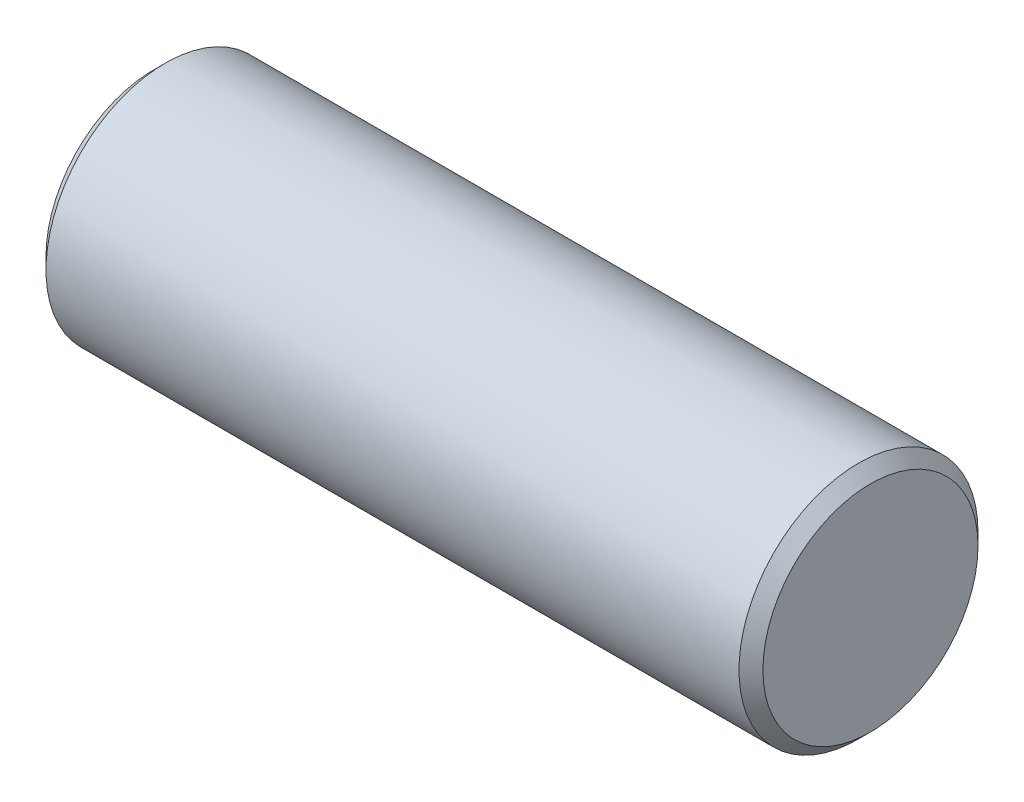
ISO-10303-21;
HEADER;
FILE_DESCRIPTION(('STEP AP214'),'2;1');
FILE_NAME('part.step','',(''),(''),'','','');
FILE_SCHEMA(('AUTOMOTIVE_DESIGN { 1 0 10303 214 1 1 1 1 }'));
ENDSEC;
DATA;
#1=APPLICATION_CONTEXT('core data for automotive mechanical design processes');
#2=APPLICATION_PROTOCOL_DEFINITION('international standard','automotive_design',2000,#1);
#3=PRODUCT_CONTEXT('',#1,'mechanical');
#4=PRODUCT('Part','Part','',(#3));
#5=PRODUCT_RELATED_PRODUCT_CATEGORY('part','',(#4));
#6=PRODUCT_DEFINITION_FORMATION('','',#4);
#7=PRODUCT_DEFINITION_CONTEXT('part definition',#1,'design');
#8=PRODUCT_DEFINITION('design','',#6,#7);
#9=PRODUCT_DEFINITION_SHAPE('','',#8);
#10=(LENGTH_UNIT() NAMED_UNIT(*) SI_UNIT(.MILLI.,.METRE.));
#11=(NAMED_UNIT(*) PLANE_ANGLE_UNIT() SI_UNIT($,.RADIAN.));
#12=(NAMED_UNIT(*) SI_UNIT($,.STERADIAN.) SOLID_ANGLE_UNIT());
#13=UNCERTAINTY_MEASURE_WITH_UNIT(LENGTH_MEASURE(1.E-05),#10,'distance_accuracy_value','');
#14=(GEOMETRIC_REPRESENTATION_CONTEXT(3) GLOBAL_UNCERTAINTY_ASSIGNED_CONTEXT((#13)) GLOBAL_UNIT_ASSIGNED_CONTEXT((#10,
#11,#12)) REPRESENTATION_CONTEXT('',''));
#15=CARTESIAN_POINT('',(0.,0.,0.));
#16=DIRECTION('',(0.,0.,1.));
#17=DIRECTION('',(1.,0.,0.));
#18=AXIS2_PLACEMENT_3D('',#15,#16,#17);
#19=CARTESIAN_POINT('',(0.,0.5,0.));
#20=DIRECTION('',(-1.,0.,0.));
#21=DIRECTION('',(0.,0.,1.));
#22=AXIS2_PLACEMENT_3D('',#19,#20,#21);
#23=PLANE('',#22);
#24=CARTESIAN_POINT('',(0.,0.,0.));
#25=DIRECTION('',(1.,0.,0.));
#26=DIRECTION('',(0.,0.,-1.));
#27=AXIS2_PLACEMENT_3D('',#24,#25,#26);
#28=CIRCLE('',#27,0.9);
#29=CARTESIAN_POINT('',(0.,0.,-0.9));
#30=VERTEX_POINT('',#29);
#31=EDGE_CURVE('E10',#30,#30,#28,.T.);
#32=ORIENTED_EDGE('',*,*,#31,.F.);
#33=EDGE_LOOP('',(#32));
#34=FACE_BOUND('',#33,.T.);
#35=ADVANCED_FACE('F33',(#34),#23,.T.);
#36=CARTESIAN_POINT('',(0.1,0.,0.));
#37=DIRECTION('',(1.,0.,0.));
#38=DIRECTION('',(0.,0.,-1.));
#39=AXIS2_PLACEMENT_3D('',#36,#37,#38);
#40=CONICAL_SURFACE('',#39,1.,0.785398163397447);
#41=ORIENTED_EDGE('',*,*,#31,.T.);
#42=EDGE_LOOP('',(#41));
#43=FACE_BOUND('',#42,.T.);
#44=CARTESIAN_POINT('',(0.1,0.,0.));
#45=DIRECTION('',(1.,0.,0.));
#46=DIRECTION('',(0.,0.,-1.));
#47=AXIS2_PLACEMENT_3D('',#44,#45,#46);
#48=CIRCLE('',#47,1.);
#49=CARTESIAN_POINT('',(0.1,0.,-1.));
#50=VERTEX_POINT('',#49);
#51=EDGE_CURVE('E39',#50,#50,#48,.T.);
#52=ORIENTED_EDGE('',*,*,#51,.F.);
#53=EDGE_LOOP('',(#52));
#54=FACE_BOUND('',#53,.T.);
#55=ADVANCED_FACE('F65',(#43,#54),#40,.T.);
#56=CARTESIAN_POINT('',(6.,0.,0.));
#57=DIRECTION('',(1.,0.,0.));
#58=DIRECTION('',(0.,0.,-1.));
#59=AXIS2_PLACEMENT_3D('',#56,#57,#58);
#60=CYLINDRICAL_SURFACE('',#59,1.);
#61=ORIENTED_EDGE('',*,*,#51,.T.);
#62=EDGE_LOOP('',(#61));
#63=FACE_BOUND('',#62,.T.);
#64=CARTESIAN_POINT('',(5.9,0.,0.));
#65=DIRECTION('',(1.,0.,0.));
#66=DIRECTION('',(0.,0.,-1.));
#67=AXIS2_PLACEMENT_3D('',#64,#65,#66);
#68=CIRCLE('',#67,1.);
#69=CARTESIAN_POINT('',(5.9,0.,-1.));
#70=VERTEX_POINT('',#69);
#71=EDGE_CURVE('E43',#70,#70,#68,.T.);
#72=ORIENTED_EDGE('',*,*,#71,.F.);
#73=EDGE_LOOP('',(#72));
#74=FACE_BOUND('',#73,.T.);
#75=ADVANCED_FACE('F57',(#63,#74),#60,.T.);
#76=CARTESIAN_POINT('',(6.,0.,0.));
#77=DIRECTION('',(-1.,0.,0.));
#78=DIRECTION('',(0.,0.,1.));
#79=AXIS2_PLACEMENT_3D('',#76,#77,#78);
#80=CONICAL_SURFACE('',#79,0.9,0.785398163397447);
#81=ORIENTED_EDGE('',*,*,#71,.T.);
#82=EDGE_LOOP('',(#81));
#83=FACE_BOUND('',#82,.T.);
#84=CARTESIAN_POINT('',(6.,0.,0.));
#85=DIRECTION('',(1.,0.,0.));
#86=DIRECTION('',(0.,0.,-1.));
#87=AXIS2_PLACEMENT_3D('',#84,#85,#86);
#88=CIRCLE('',#87,0.9);
#89=CARTESIAN_POINT('',(6.,0.,-0.9));
#90=VERTEX_POINT('',#89);
#91=EDGE_CURVE('E47',#90,#90,#88,.T.);
#92=ORIENTED_EDGE('',*,*,#91,.F.);
#93=EDGE_LOOP('',(#92));
#94=FACE_BOUND('',#93,.T.);
#95=ADVANCED_FACE('F55',(#83,#94),#80,.T.);
#96=CARTESIAN_POINT('',(6.,0.5,0.));
#97=DIRECTION('',(1.,0.,0.));
#98=DIRECTION('',(0.,0.,-1.));
#99=AXIS2_PLACEMENT_3D('',#96,#97,#98);
#100=PLANE('',#99);
#101=ORIENTED_EDGE('',*,*,#91,.T.);
#102=EDGE_LOOP('',(#101));
#103=FACE_BOUND('',#102,.T.);
#104=ADVANCED_FACE('F53',(#103),#100,.T.);
#105=CLOSED_SHELL('',(#35,#55,#75,#95,#104));
#106=MANIFOLD_SOLID_BREP('B2',#105);
#107=ADVANCED_BREP_SHAPE_REPRESENTATION('',(#18,#106),#14);
#108=SHAPE_DEFINITION_REPRESENTATION(#9,#107);
ENDSEC;
END-ISO-10303-21;
